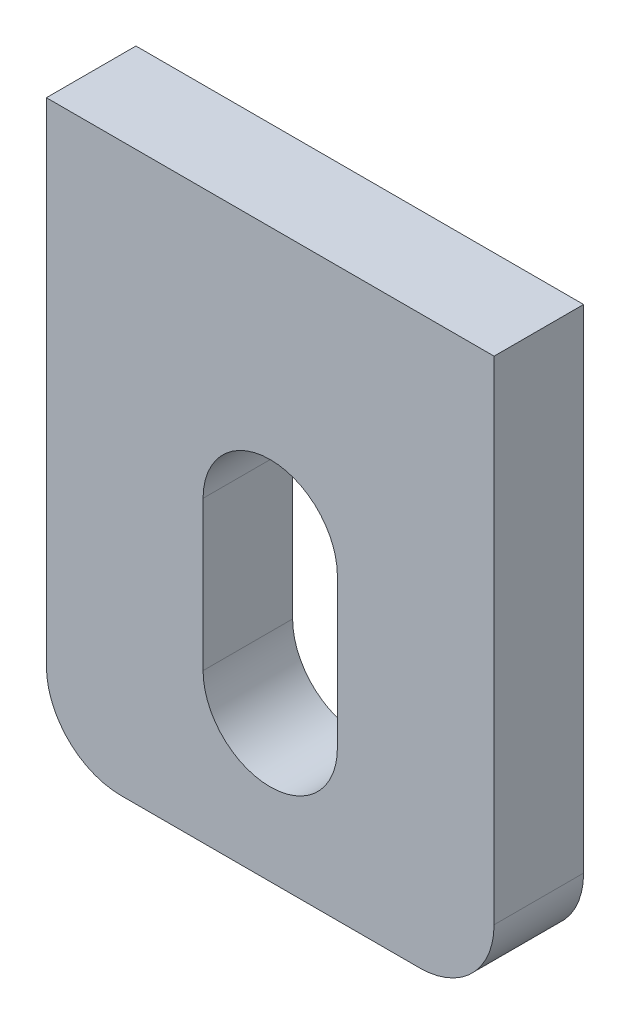
ISO-10303-21;
HEADER;
FILE_DESCRIPTION(('STEP AP214'),'2;1');
FILE_NAME('part.step','',(''),(''),'','','');
FILE_SCHEMA(('AUTOMOTIVE_DESIGN { 1 0 10303 214 1 1 1 1 }'));
ENDSEC;
DATA;
#1=APPLICATION_CONTEXT('core data for automotive mechanical design processes');
#2=APPLICATION_PROTOCOL_DEFINITION('international standard','automotive_design',2000,#1);
#3=PRODUCT_CONTEXT('',#1,'mechanical');
#4=PRODUCT('Part','Part','',(#3));
#5=PRODUCT_RELATED_PRODUCT_CATEGORY('part','',(#4));
#6=PRODUCT_DEFINITION_FORMATION('','',#4);
#7=PRODUCT_DEFINITION_CONTEXT('part definition',#1,'design');
#8=PRODUCT_DEFINITION('design','',#6,#7);
#9=PRODUCT_DEFINITION_SHAPE('','',#8);
#10=(LENGTH_UNIT() NAMED_UNIT(*) SI_UNIT(.MILLI.,.METRE.));
#11=(NAMED_UNIT(*) PLANE_ANGLE_UNIT() SI_UNIT($,.RADIAN.));
#12=(NAMED_UNIT(*) SI_UNIT($,.STERADIAN.) SOLID_ANGLE_UNIT());
#13=UNCERTAINTY_MEASURE_WITH_UNIT(LENGTH_MEASURE(1.E-05),#10,'distance_accuracy_value','');
#14=(GEOMETRIC_REPRESENTATION_CONTEXT(3) GLOBAL_UNCERTAINTY_ASSIGNED_CONTEXT((#13)) GLOBAL_UNIT_ASSIGNED_CONTEXT((#10,
#11,#12)) REPRESENTATION_CONTEXT('',''));
#15=CARTESIAN_POINT('',(0.,0.,0.));
#16=DIRECTION('',(0.,0.,1.));
#17=DIRECTION('',(1.,0.,0.));
#18=AXIS2_PLACEMENT_3D('',#15,#16,#17);
#19=CARTESIAN_POINT('',(0.,0.,6.));
#20=DIRECTION('',(0.,0.,-1.));
#21=DIRECTION('',(-1.,0.,0.));
#22=AXIS2_PLACEMENT_3D('',#19,#20,#21);
#23=PLANE('',#22);
#24=DIRECTION('',(1.,0.,0.));
#25=VECTOR('',#24,1.);
#26=CARTESIAN_POINT('',(0.,0.,6.));
#27=LINE('',#26,#25);
#28=CARTESIAN_POINT('',(5.,0.,6.));
#29=VERTEX_POINT('',#28);
#30=CARTESIAN_POINT('',(25.,0.,6.));
#31=VERTEX_POINT('',#30);
#32=EDGE_CURVE('E157',#29,#31,#27,.T.);
#33=ORIENTED_EDGE('',*,*,#32,.T.);
#34=CARTESIAN_POINT('',(25.,5.,6.));
#35=DIRECTION('',(0.,0.,-1.));
#36=DIRECTION('',(-1.,0.,0.));
#37=AXIS2_PLACEMENT_3D('',#34,#35,#36);
#38=CIRCLE('',#37,5.);
#39=CARTESIAN_POINT('',(30.,5.,6.));
#40=VERTEX_POINT('',#39);
#41=EDGE_CURVE('E42',#31,#40,#38,.F.);
#42=ORIENTED_EDGE('',*,*,#41,.T.);
#43=DIRECTION('',(0.,1.,0.));
#44=VECTOR('',#43,1.);
#45=CARTESIAN_POINT('',(30.,0.,6.));
#46=LINE('',#45,#44);
#47=CARTESIAN_POINT('',(30.,38.,6.));
#48=VERTEX_POINT('',#47);
#49=EDGE_CURVE('E160',#40,#48,#46,.T.);
#50=ORIENTED_EDGE('',*,*,#49,.T.);
#51=DIRECTION('',(-1.,0.,0.));
#52=VECTOR('',#51,1.);
#53=CARTESIAN_POINT('',(0.,38.,6.));
#54=LINE('',#53,#52);
#55=CARTESIAN_POINT('',(0.,38.,6.));
#56=VERTEX_POINT('',#55);
#57=EDGE_CURVE('E162',#48,#56,#54,.T.);
#58=ORIENTED_EDGE('',*,*,#57,.T.);
#59=DIRECTION('',(0.,-1.,0.));
#60=VECTOR('',#59,1.);
#61=CARTESIAN_POINT('',(0.,0.,6.));
#62=LINE('',#61,#60);
#63=CARTESIAN_POINT('',(0.,5.,6.));
#64=VERTEX_POINT('',#63);
#65=EDGE_CURVE('E155',#56,#64,#62,.T.);
#66=ORIENTED_EDGE('',*,*,#65,.T.);
#67=CARTESIAN_POINT('',(5.,5.,6.));
#68=DIRECTION('',(0.,0.,-1.));
#69=DIRECTION('',(-1.,0.,0.));
#70=AXIS2_PLACEMENT_3D('',#67,#68,#69);
#71=CIRCLE('',#70,5.);
#72=EDGE_CURVE('E187',#64,#29,#71,.F.);
#73=ORIENTED_EDGE('',*,*,#72,.T.);
#74=EDGE_LOOP('',(#33,#42,#50,#58,#66,#73));
#75=FACE_BOUND('',#74,.T.);
#76=CARTESIAN_POINT('',(15.,20.,6.));
#77=DIRECTION('',(0.,0.,1.));
#78=DIRECTION('',(1.,0.,0.));
#79=AXIS2_PLACEMENT_3D('',#76,#77,#78);
#80=CIRCLE('',#79,4.5);
#81=CARTESIAN_POINT('',(19.5,20.,6.));
#82=VERTEX_POINT('',#81);
#83=CARTESIAN_POINT('',(10.5,20.,6.));
#84=VERTEX_POINT('',#83);
#85=EDGE_CURVE('E114',#82,#84,#80,.T.);
#86=ORIENTED_EDGE('',*,*,#85,.F.);
#87=DIRECTION('',(0.,1.,0.));
#88=VECTOR('',#87,1.);
#89=CARTESIAN_POINT('',(19.5,20.,6.));
#90=LINE('',#89,#88);
#91=CARTESIAN_POINT('',(19.5,10.,6.));
#92=VERTEX_POINT('',#91);
#93=EDGE_CURVE('E139',#92,#82,#90,.T.);
#94=ORIENTED_EDGE('',*,*,#93,.F.);
#95=CARTESIAN_POINT('',(15.,10.,6.));
#96=DIRECTION('',(0.,0.,1.));
#97=DIRECTION('',(1.,0.,0.));
#98=AXIS2_PLACEMENT_3D('',#95,#96,#97);
#99=CIRCLE('',#98,4.5);
#100=CARTESIAN_POINT('',(10.5,10.,6.));
#101=VERTEX_POINT('',#100);
#102=EDGE_CURVE('E137',#101,#92,#99,.T.);
#103=ORIENTED_EDGE('',*,*,#102,.F.);
#104=DIRECTION('',(0.,-1.,0.));
#105=VECTOR('',#104,1.);
#106=CARTESIAN_POINT('',(10.5,20.,6.));
#107=LINE('',#106,#105);
#108=EDGE_CURVE('E124',#84,#101,#107,.T.);
#109=ORIENTED_EDGE('',*,*,#108,.F.);
#110=EDGE_LOOP('',(#86,#94,#103,#109));
#111=FACE_BOUND('',#110,.T.);
#112=ADVANCED_FACE('F34',(#75,#111),#23,.F.);
#113=CARTESIAN_POINT('',(0.,0.,0.));
#114=DIRECTION('',(0.,0.,-1.));
#115=DIRECTION('',(-1.,0.,0.));
#116=AXIS2_PLACEMENT_3D('',#113,#114,#115);
#117=PLANE('',#116);
#118=DIRECTION('',(0.,1.,0.));
#119=VECTOR('',#118,1.);
#120=CARTESIAN_POINT('',(30.,0.,0.));
#121=LINE('',#120,#119);
#122=CARTESIAN_POINT('',(30.,5.,0.));
#123=VERTEX_POINT('',#122);
#124=CARTESIAN_POINT('',(30.,38.,0.));
#125=VERTEX_POINT('',#124);
#126=EDGE_CURVE('E168',#123,#125,#121,.T.);
#127=ORIENTED_EDGE('',*,*,#126,.F.);
#128=CARTESIAN_POINT('',(25.,5.,0.));
#129=DIRECTION('',(0.,0.,-1.));
#130=DIRECTION('',(-1.,0.,0.));
#131=AXIS2_PLACEMENT_3D('',#128,#129,#130);
#132=CIRCLE('',#131,5.);
#133=CARTESIAN_POINT('',(25.,0.,0.));
#134=VERTEX_POINT('',#133);
#135=EDGE_CURVE('E181',#123,#134,#132,.T.);
#136=ORIENTED_EDGE('',*,*,#135,.T.);
#137=DIRECTION('',(1.,0.,0.));
#138=VECTOR('',#137,1.);
#139=CARTESIAN_POINT('',(0.,0.,0.));
#140=LINE('',#139,#138);
#141=CARTESIAN_POINT('',(5.,0.,0.));
#142=VERTEX_POINT('',#141);
#143=EDGE_CURVE('E166',#142,#134,#140,.T.);
#144=ORIENTED_EDGE('',*,*,#143,.F.);
#145=CARTESIAN_POINT('',(5.,5.,0.));
#146=DIRECTION('',(0.,0.,-1.));
#147=DIRECTION('',(-1.,0.,0.));
#148=AXIS2_PLACEMENT_3D('',#145,#146,#147);
#149=CIRCLE('',#148,5.);
#150=CARTESIAN_POINT('',(0.,5.,0.));
#151=VERTEX_POINT('',#150);
#152=EDGE_CURVE('E179',#142,#151,#149,.T.);
#153=ORIENTED_EDGE('',*,*,#152,.T.);
#154=DIRECTION('',(0.,-1.,0.));
#155=VECTOR('',#154,1.);
#156=CARTESIAN_POINT('',(0.,0.,0.));
#157=LINE('',#156,#155);
#158=CARTESIAN_POINT('',(0.,38.,0.));
#159=VERTEX_POINT('',#158);
#160=EDGE_CURVE('E132',#159,#151,#157,.T.);
#161=ORIENTED_EDGE('',*,*,#160,.F.);
#162=DIRECTION('',(-1.,0.,0.));
#163=VECTOR('',#162,1.);
#164=CARTESIAN_POINT('',(0.,38.,0.));
#165=LINE('',#164,#163);
#166=EDGE_CURVE('E158',#125,#159,#165,.T.);
#167=ORIENTED_EDGE('',*,*,#166,.F.);
#168=EDGE_LOOP('',(#127,#136,#144,#153,#161,#167));
#169=FACE_BOUND('',#168,.T.);
#170=DIRECTION('',(0.,1.,0.));
#171=VECTOR('',#170,1.);
#172=CARTESIAN_POINT('',(19.5,20.,0.));
#173=LINE('',#172,#171);
#174=CARTESIAN_POINT('',(19.5,10.,0.));
#175=VERTEX_POINT('',#174);
#176=CARTESIAN_POINT('',(19.5,20.,0.));
#177=VERTEX_POINT('',#176);
#178=EDGE_CURVE('E125',#175,#177,#173,.T.);
#179=ORIENTED_EDGE('',*,*,#178,.T.);
#180=CARTESIAN_POINT('',(15.,20.,0.));
#181=DIRECTION('',(0.,0.,1.));
#182=DIRECTION('',(1.,0.,0.));
#183=AXIS2_PLACEMENT_3D('',#180,#181,#182);
#184=CIRCLE('',#183,4.5);
#185=CARTESIAN_POINT('',(10.5,20.,0.));
#186=VERTEX_POINT('',#185);
#187=EDGE_CURVE('E143',#177,#186,#184,.T.);
#188=ORIENTED_EDGE('',*,*,#187,.T.);
#189=DIRECTION('',(0.,-1.,0.));
#190=VECTOR('',#189,1.);
#191=CARTESIAN_POINT('',(10.5,20.,0.));
#192=LINE('',#191,#190);
#193=CARTESIAN_POINT('',(10.5,10.,0.));
#194=VERTEX_POINT('',#193);
#195=EDGE_CURVE('E131',#186,#194,#192,.T.);
#196=ORIENTED_EDGE('',*,*,#195,.T.);
#197=CARTESIAN_POINT('',(15.,10.,0.));
#198=DIRECTION('',(0.,0.,1.));
#199=DIRECTION('',(1.,0.,0.));
#200=AXIS2_PLACEMENT_3D('',#197,#198,#199);
#201=CIRCLE('',#200,4.5);
#202=EDGE_CURVE('E146',#194,#175,#201,.T.);
#203=ORIENTED_EDGE('',*,*,#202,.T.);
#204=EDGE_LOOP('',(#179,#188,#196,#203));
#205=FACE_BOUND('',#204,.T.);
#206=ADVANCED_FACE('F201',(#169,#205),#117,.T.);
#207=CARTESIAN_POINT('',(0.,0.,6.));
#208=DIRECTION('',(1.,0.,0.));
#209=DIRECTION('',(0.,0.,-1.));
#210=AXIS2_PLACEMENT_3D('',#207,#208,#209);
#211=PLANE('',#210);
#212=ORIENTED_EDGE('',*,*,#160,.T.);
#213=DIRECTION('',(0.,0.,-1.));
#214=VECTOR('',#213,1.);
#215=CARTESIAN_POINT('',(0.,5.,6.));
#216=LINE('',#215,#214);
#217=EDGE_CURVE('E11',#151,#64,#216,.F.);
#218=ORIENTED_EDGE('',*,*,#217,.T.);
#219=ORIENTED_EDGE('',*,*,#65,.F.);
#220=DIRECTION('',(0.,0.,-1.));
#221=VECTOR('',#220,1.);
#222=CARTESIAN_POINT('',(0.,38.,6.));
#223=LINE('',#222,#221);
#224=EDGE_CURVE('E164',#56,#159,#223,.T.);
#225=ORIENTED_EDGE('',*,*,#224,.T.);
#226=EDGE_LOOP('',(#212,#218,#219,#225));
#227=FACE_BOUND('',#226,.T.);
#228=ADVANCED_FACE('F209',(#227),#211,.F.);
#229=CARTESIAN_POINT('',(0.,0.,6.));
#230=DIRECTION('',(0.,1.,0.));
#231=DIRECTION('',(0.,0.,1.));
#232=AXIS2_PLACEMENT_3D('',#229,#230,#231);
#233=PLANE('',#232);
#234=ORIENTED_EDGE('',*,*,#143,.T.);
#235=DIRECTION('',(0.,0.,-1.));
#236=VECTOR('',#235,1.);
#237=CARTESIAN_POINT('',(25.,0.,6.));
#238=LINE('',#237,#236);
#239=EDGE_CURVE('E55',#134,#31,#238,.F.);
#240=ORIENTED_EDGE('',*,*,#239,.T.);
#241=ORIENTED_EDGE('',*,*,#32,.F.);
#242=DIRECTION('',(0.,0.,-1.));
#243=VECTOR('',#242,1.);
#244=CARTESIAN_POINT('',(5.,0.,6.));
#245=LINE('',#244,#243);
#246=EDGE_CURVE('E183',#29,#142,#245,.T.);
#247=ORIENTED_EDGE('',*,*,#246,.T.);
#248=EDGE_LOOP('',(#234,#240,#241,#247));
#249=FACE_BOUND('',#248,.T.);
#250=ADVANCED_FACE('F204',(#249),#233,.F.);
#251=CARTESIAN_POINT('',(30.,0.,6.));
#252=DIRECTION('',(-1.,0.,0.));
#253=DIRECTION('',(0.,0.,1.));
#254=AXIS2_PLACEMENT_3D('',#251,#252,#253);
#255=PLANE('',#254);
#256=ORIENTED_EDGE('',*,*,#49,.F.);
#257=DIRECTION('',(0.,0.,-1.));
#258=VECTOR('',#257,1.);
#259=CARTESIAN_POINT('',(30.,5.,6.));
#260=LINE('',#259,#258);
#261=EDGE_CURVE('E176',#40,#123,#260,.T.);
#262=ORIENTED_EDGE('',*,*,#261,.T.);
#263=ORIENTED_EDGE('',*,*,#126,.T.);
#264=DIRECTION('',(0.,0.,-1.));
#265=VECTOR('',#264,1.);
#266=CARTESIAN_POINT('',(30.,38.,6.));
#267=LINE('',#266,#265);
#268=EDGE_CURVE('E173',#48,#125,#267,.T.);
#269=ORIENTED_EDGE('',*,*,#268,.F.);
#270=EDGE_LOOP('',(#256,#262,#263,#269));
#271=FACE_BOUND('',#270,.T.);
#272=ADVANCED_FACE('F195',(#271),#255,.F.);
#273=CARTESIAN_POINT('',(0.,38.,6.));
#274=DIRECTION('',(0.,-1.,0.));
#275=DIRECTION('',(0.,0.,-1.));
#276=AXIS2_PLACEMENT_3D('',#273,#274,#275);
#277=PLANE('',#276);
#278=ORIENTED_EDGE('',*,*,#166,.T.);
#279=ORIENTED_EDGE('',*,*,#224,.F.);
#280=ORIENTED_EDGE('',*,*,#57,.F.);
#281=ORIENTED_EDGE('',*,*,#268,.T.);
#282=EDGE_LOOP('',(#278,#279,#280,#281));
#283=FACE_BOUND('',#282,.T.);
#284=ADVANCED_FACE('F212',(#283),#277,.F.);
#285=CARTESIAN_POINT('',(15.,20.,6.));
#286=DIRECTION('',(0.,0.,-1.));
#287=DIRECTION('',(-1.,0.,0.));
#288=AXIS2_PLACEMENT_3D('',#285,#286,#287);
#289=CYLINDRICAL_SURFACE('',#288,4.5);
#290=ORIENTED_EDGE('',*,*,#187,.F.);
#291=DIRECTION('',(0.,0.,-1.));
#292=VECTOR('',#291,1.);
#293=CARTESIAN_POINT('',(19.5,20.,6.));
#294=LINE('',#293,#292);
#295=EDGE_CURVE('E120',#82,#177,#294,.T.);
#296=ORIENTED_EDGE('',*,*,#295,.F.);
#297=ORIENTED_EDGE('',*,*,#85,.T.);
#298=DIRECTION('',(0.,0.,-1.));
#299=VECTOR('',#298,1.);
#300=CARTESIAN_POINT('',(10.5,20.,6.));
#301=LINE('',#300,#299);
#302=EDGE_CURVE('E117',#84,#186,#301,.T.);
#303=ORIENTED_EDGE('',*,*,#302,.T.);
#304=EDGE_LOOP('',(#290,#296,#297,#303));
#305=FACE_BOUND('',#304,.T.);
#306=ADVANCED_FACE('F116',(#305),#289,.F.);
#307=CARTESIAN_POINT('',(10.5,20.,6.));
#308=DIRECTION('',(1.,0.,0.));
#309=DIRECTION('',(0.,1.,0.));
#310=AXIS2_PLACEMENT_3D('',#307,#308,#309);
#311=PLANE('',#310);
#312=ORIENTED_EDGE('',*,*,#195,.F.);
#313=ORIENTED_EDGE('',*,*,#302,.F.);
#314=ORIENTED_EDGE('',*,*,#108,.T.);
#315=DIRECTION('',(0.,0.,-1.));
#316=VECTOR('',#315,1.);
#317=CARTESIAN_POINT('',(10.5,10.,6.));
#318=LINE('',#317,#316);
#319=EDGE_CURVE('E133',#101,#194,#318,.T.);
#320=ORIENTED_EDGE('',*,*,#319,.T.);
#321=EDGE_LOOP('',(#312,#313,#314,#320));
#322=FACE_BOUND('',#321,.T.);
#323=ADVANCED_FACE('F128',(#322),#311,.T.);
#324=CARTESIAN_POINT('',(15.,10.,6.));
#325=DIRECTION('',(0.,0.,-1.));
#326=DIRECTION('',(-1.,0.,0.));
#327=AXIS2_PLACEMENT_3D('',#324,#325,#326);
#328=CYLINDRICAL_SURFACE('',#327,4.5);
#329=ORIENTED_EDGE('',*,*,#202,.F.);
#330=ORIENTED_EDGE('',*,*,#319,.F.);
#331=ORIENTED_EDGE('',*,*,#102,.T.);
#332=DIRECTION('',(0.,0.,-1.));
#333=VECTOR('',#332,1.);
#334=CARTESIAN_POINT('',(19.5,10.,6.));
#335=LINE('',#334,#333);
#336=EDGE_CURVE('E152',#92,#175,#335,.T.);
#337=ORIENTED_EDGE('',*,*,#336,.T.);
#338=EDGE_LOOP('',(#329,#330,#331,#337));
#339=FACE_BOUND('',#338,.T.);
#340=ADVANCED_FACE('F230',(#339),#328,.F.);
#341=CARTESIAN_POINT('',(19.5,20.,6.));
#342=DIRECTION('',(-1.,0.,0.));
#343=DIRECTION('',(0.,0.,1.));
#344=AXIS2_PLACEMENT_3D('',#341,#342,#343);
#345=PLANE('',#344);
#346=ORIENTED_EDGE('',*,*,#178,.F.);
#347=ORIENTED_EDGE('',*,*,#336,.F.);
#348=ORIENTED_EDGE('',*,*,#93,.T.);
#349=ORIENTED_EDGE('',*,*,#295,.T.);
#350=EDGE_LOOP('',(#346,#347,#348,#349));
#351=FACE_BOUND('',#350,.T.);
#352=ADVANCED_FACE('F233',(#351),#345,.T.);
#353=CARTESIAN_POINT('',(25.,5.,6.));
#354=DIRECTION('',(0.,0.,-1.));
#355=DIRECTION('',(-1.,0.,0.));
#356=AXIS2_PLACEMENT_3D('',#353,#354,#355);
#357=CYLINDRICAL_SURFACE('',#356,5.);
#358=ORIENTED_EDGE('',*,*,#41,.F.);
#359=ORIENTED_EDGE('',*,*,#239,.F.);
#360=ORIENTED_EDGE('',*,*,#135,.F.);
#361=ORIENTED_EDGE('',*,*,#261,.F.);
#362=EDGE_LOOP('',(#358,#359,#360,#361));
#363=FACE_BOUND('',#362,.T.);
#364=ADVANCED_FACE('F198',(#363),#357,.T.);
#365=CARTESIAN_POINT('',(5.,5.,6.));
#366=DIRECTION('',(0.,0.,-1.));
#367=DIRECTION('',(-1.,0.,0.));
#368=AXIS2_PLACEMENT_3D('',#365,#366,#367);
#369=CYLINDRICAL_SURFACE('',#368,5.);
#370=ORIENTED_EDGE('',*,*,#72,.F.);
#371=ORIENTED_EDGE('',*,*,#217,.F.);
#372=ORIENTED_EDGE('',*,*,#152,.F.);
#373=ORIENTED_EDGE('',*,*,#246,.F.);
#374=EDGE_LOOP('',(#370,#371,#372,#373));
#375=FACE_BOUND('',#374,.T.);
#376=ADVANCED_FACE('F36',(#375),#369,.T.);
#377=CLOSED_SHELL('',(#112,#206,#228,#250,#272,#284,#306,#323,#340,#352,#364,#376));
#378=MANIFOLD_SOLID_BREP('B2',#377);
#379=ADVANCED_BREP_SHAPE_REPRESENTATION('',(#18,#378),#14);
#380=SHAPE_DEFINITION_REPRESENTATION(#9,#379);
ENDSEC;
END-ISO-10303-21;
